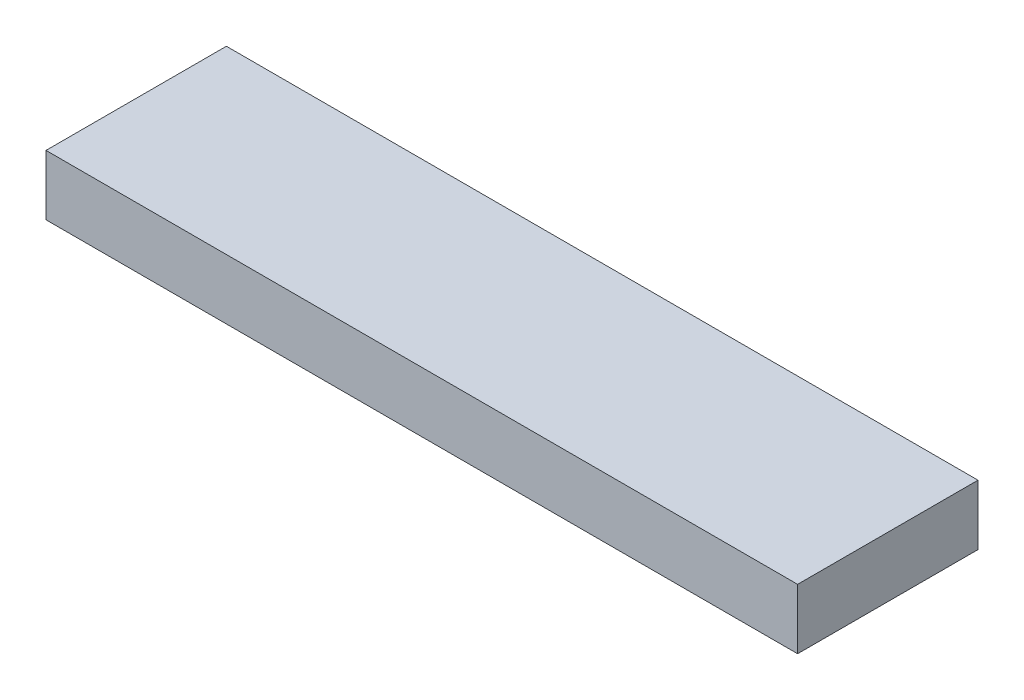
ISO-10303-21;
HEADER;
FILE_DESCRIPTION(('STEP AP214'),'2;1');
FILE_NAME('part.step','',(''),(''),'','','');
FILE_SCHEMA(('AUTOMOTIVE_DESIGN { 1 0 10303 214 1 1 1 1 }'));
ENDSEC;
DATA;
#1=APPLICATION_CONTEXT('core data for automotive mechanical design processes');
#2=APPLICATION_PROTOCOL_DEFINITION('international standard','automotive_design',2000,#1);
#3=PRODUCT_CONTEXT('',#1,'mechanical');
#4=PRODUCT('Part','Part','',(#3));
#5=PRODUCT_RELATED_PRODUCT_CATEGORY('part','',(#4));
#6=PRODUCT_DEFINITION_FORMATION('','',#4);
#7=PRODUCT_DEFINITION_CONTEXT('part definition',#1,'design');
#8=PRODUCT_DEFINITION('design','',#6,#7);
#9=PRODUCT_DEFINITION_SHAPE('','',#8);
#10=(LENGTH_UNIT() NAMED_UNIT(*) SI_UNIT(.MILLI.,.METRE.));
#11=(NAMED_UNIT(*) PLANE_ANGLE_UNIT() SI_UNIT($,.RADIAN.));
#12=(NAMED_UNIT(*) SI_UNIT($,.STERADIAN.) SOLID_ANGLE_UNIT());
#13=UNCERTAINTY_MEASURE_WITH_UNIT(LENGTH_MEASURE(1.E-05),#10,'distance_accuracy_value','');
#14=(GEOMETRIC_REPRESENTATION_CONTEXT(3) GLOBAL_UNCERTAINTY_ASSIGNED_CONTEXT((#13)) GLOBAL_UNIT_ASSIGNED_CONTEXT((#10,
#11,#12)) REPRESENTATION_CONTEXT('',''));
#15=CARTESIAN_POINT('',(0.,0.,0.));
#16=DIRECTION('',(0.,0.,1.));
#17=DIRECTION('',(1.,0.,0.));
#18=AXIS2_PLACEMENT_3D('',#15,#16,#17);
#19=CARTESIAN_POINT('',(0.,4.,0.));
#20=DIRECTION('',(1.,0.,0.));
#21=DIRECTION('',(0.,0.,-1.));
#22=AXIS2_PLACEMENT_3D('',#19,#20,#21);
#23=PLANE('',#22);
#24=DIRECTION('',(0.,0.,1.));
#25=VECTOR('',#24,1.);
#26=CARTESIAN_POINT('',(0.,0.,0.));
#27=LINE('',#26,#25);
#28=CARTESIAN_POINT('',(0.,0.,-12.));
#29=VERTEX_POINT('',#28);
#30=CARTESIAN_POINT('',(0.,0.,0.));
#31=VERTEX_POINT('',#30);
#32=EDGE_CURVE('E96',#29,#31,#27,.T.);
#33=ORIENTED_EDGE('',*,*,#32,.T.);
#34=DIRECTION('',(0.,-1.,0.));
#35=VECTOR('',#34,1.);
#36=CARTESIAN_POINT('',(0.,4.,0.));
#37=LINE('',#36,#35);
#38=CARTESIAN_POINT('',(0.,4.,0.));
#39=VERTEX_POINT('',#38);
#40=EDGE_CURVE('E11',#39,#31,#37,.T.);
#41=ORIENTED_EDGE('',*,*,#40,.F.);
#42=DIRECTION('',(0.,0.,1.));
#43=VECTOR('',#42,1.);
#44=CARTESIAN_POINT('',(0.,4.,0.));
#45=LINE('',#44,#43);
#46=CARTESIAN_POINT('',(0.,4.,-12.));
#47=VERTEX_POINT('',#46);
#48=EDGE_CURVE('E84',#47,#39,#45,.T.);
#49=ORIENTED_EDGE('',*,*,#48,.F.);
#50=DIRECTION('',(0.,-1.,0.));
#51=VECTOR('',#50,1.);
#52=CARTESIAN_POINT('',(0.,4.,-12.));
#53=LINE('',#52,#51);
#54=EDGE_CURVE('E92',#47,#29,#53,.T.);
#55=ORIENTED_EDGE('',*,*,#54,.T.);
#56=EDGE_LOOP('',(#33,#41,#49,#55));
#57=FACE_BOUND('',#56,.T.);
#58=ADVANCED_FACE('F33',(#57),#23,.F.);
#59=CARTESIAN_POINT('',(0.,4.,0.));
#60=DIRECTION('',(0.,0.,-1.));
#61=DIRECTION('',(-1.,0.,0.));
#62=AXIS2_PLACEMENT_3D('',#59,#60,#61);
#63=PLANE('',#62);
#64=DIRECTION('',(1.,0.,0.));
#65=VECTOR('',#64,1.);
#66=CARTESIAN_POINT('',(0.,0.,0.));
#67=LINE('',#66,#65);
#68=CARTESIAN_POINT('',(50.,0.,0.));
#69=VERTEX_POINT('',#68);
#70=EDGE_CURVE('E88',#31,#69,#67,.T.);
#71=ORIENTED_EDGE('',*,*,#70,.T.);
#72=DIRECTION('',(0.,-1.,0.));
#73=VECTOR('',#72,1.);
#74=CARTESIAN_POINT('',(50.,4.,0.));
#75=LINE('',#74,#73);
#76=CARTESIAN_POINT('',(50.,4.,0.));
#77=VERTEX_POINT('',#76);
#78=EDGE_CURVE('E41',#77,#69,#75,.T.);
#79=ORIENTED_EDGE('',*,*,#78,.F.);
#80=DIRECTION('',(1.,0.,0.));
#81=VECTOR('',#80,1.);
#82=CARTESIAN_POINT('',(0.,4.,0.));
#83=LINE('',#82,#81);
#84=EDGE_CURVE('E79',#39,#77,#83,.T.);
#85=ORIENTED_EDGE('',*,*,#84,.F.);
#86=ORIENTED_EDGE('',*,*,#40,.T.);
#87=EDGE_LOOP('',(#71,#79,#85,#86));
#88=FACE_BOUND('',#87,.T.);
#89=ADVANCED_FACE('F87',(#88),#63,.F.);
#90=CARTESIAN_POINT('',(50.,4.,0.));
#91=DIRECTION('',(-1.,0.,0.));
#92=DIRECTION('',(0.,0.,1.));
#93=AXIS2_PLACEMENT_3D('',#90,#91,#92);
#94=PLANE('',#93);
#95=DIRECTION('',(0.,0.,-1.));
#96=VECTOR('',#95,1.);
#97=CARTESIAN_POINT('',(50.,0.,0.));
#98=LINE('',#97,#96);
#99=CARTESIAN_POINT('',(50.,0.,-12.));
#100=VERTEX_POINT('',#99);
#101=EDGE_CURVE('E66',#69,#100,#98,.T.);
#102=ORIENTED_EDGE('',*,*,#101,.T.);
#103=DIRECTION('',(0.,-1.,0.));
#104=VECTOR('',#103,1.);
#105=CARTESIAN_POINT('',(50.,4.,-12.));
#106=LINE('',#105,#104);
#107=CARTESIAN_POINT('',(50.,4.,-12.));
#108=VERTEX_POINT('',#107);
#109=EDGE_CURVE('E89',#108,#100,#106,.T.);
#110=ORIENTED_EDGE('',*,*,#109,.F.);
#111=DIRECTION('',(0.,0.,-1.));
#112=VECTOR('',#111,1.);
#113=CARTESIAN_POINT('',(50.,4.,0.));
#114=LINE('',#113,#112);
#115=EDGE_CURVE('E82',#77,#108,#114,.T.);
#116=ORIENTED_EDGE('',*,*,#115,.F.);
#117=ORIENTED_EDGE('',*,*,#78,.T.);
#118=EDGE_LOOP('',(#102,#110,#116,#117));
#119=FACE_BOUND('',#118,.T.);
#120=ADVANCED_FACE('F90',(#119),#94,.F.);
#121=CARTESIAN_POINT('',(0.,4.,-12.));
#122=DIRECTION('',(0.,0.,1.));
#123=DIRECTION('',(1.,0.,0.));
#124=AXIS2_PLACEMENT_3D('',#121,#122,#123);
#125=PLANE('',#124);
#126=DIRECTION('',(-1.,0.,0.));
#127=VECTOR('',#126,1.);
#128=CARTESIAN_POINT('',(0.,0.,-12.));
#129=LINE('',#128,#127);
#130=EDGE_CURVE('E72',#100,#29,#129,.T.);
#131=ORIENTED_EDGE('',*,*,#130,.T.);
#132=ORIENTED_EDGE('',*,*,#54,.F.);
#133=DIRECTION('',(-1.,0.,0.));
#134=VECTOR('',#133,1.);
#135=CARTESIAN_POINT('',(0.,4.,-12.));
#136=LINE('',#135,#134);
#137=EDGE_CURVE('E49',#108,#47,#136,.T.);
#138=ORIENTED_EDGE('',*,*,#137,.F.);
#139=ORIENTED_EDGE('',*,*,#109,.T.);
#140=EDGE_LOOP('',(#131,#132,#138,#139));
#141=FACE_BOUND('',#140,.T.);
#142=ADVANCED_FACE('F103',(#141),#125,.F.);
#143=CARTESIAN_POINT('',(0.,4.,0.));
#144=DIRECTION('',(0.,-1.,0.));
#145=DIRECTION('',(0.,0.,-1.));
#146=AXIS2_PLACEMENT_3D('',#143,#144,#145);
#147=PLANE('',#146);
#148=ORIENTED_EDGE('',*,*,#48,.T.);
#149=ORIENTED_EDGE('',*,*,#84,.T.);
#150=ORIENTED_EDGE('',*,*,#115,.T.);
#151=ORIENTED_EDGE('',*,*,#137,.T.);
#152=EDGE_LOOP('',(#148,#149,#150,#151));
#153=FACE_BOUND('',#152,.T.);
#154=ADVANCED_FACE('F80',(#153),#147,.F.);
#155=CARTESIAN_POINT('',(0.,0.,0.));
#156=DIRECTION('',(0.,-1.,0.));
#157=DIRECTION('',(0.,0.,-1.));
#158=AXIS2_PLACEMENT_3D('',#155,#156,#157);
#159=PLANE('',#158);
#160=ORIENTED_EDGE('',*,*,#32,.F.);
#161=ORIENTED_EDGE('',*,*,#130,.F.);
#162=ORIENTED_EDGE('',*,*,#101,.F.);
#163=ORIENTED_EDGE('',*,*,#70,.F.);
#164=EDGE_LOOP('',(#160,#161,#162,#163));
#165=FACE_BOUND('',#164,.T.);
#166=ADVANCED_FACE('F106',(#165),#159,.T.);
#167=CLOSED_SHELL('',(#58,#89,#120,#142,#154,#166));
#168=MANIFOLD_SOLID_BREP('B2',#167);
#169=ADVANCED_BREP_SHAPE_REPRESENTATION('',(#18,#168),#14);
#170=SHAPE_DEFINITION_REPRESENTATION(#9,#169);
ENDSEC;
END-ISO-10303-21;
